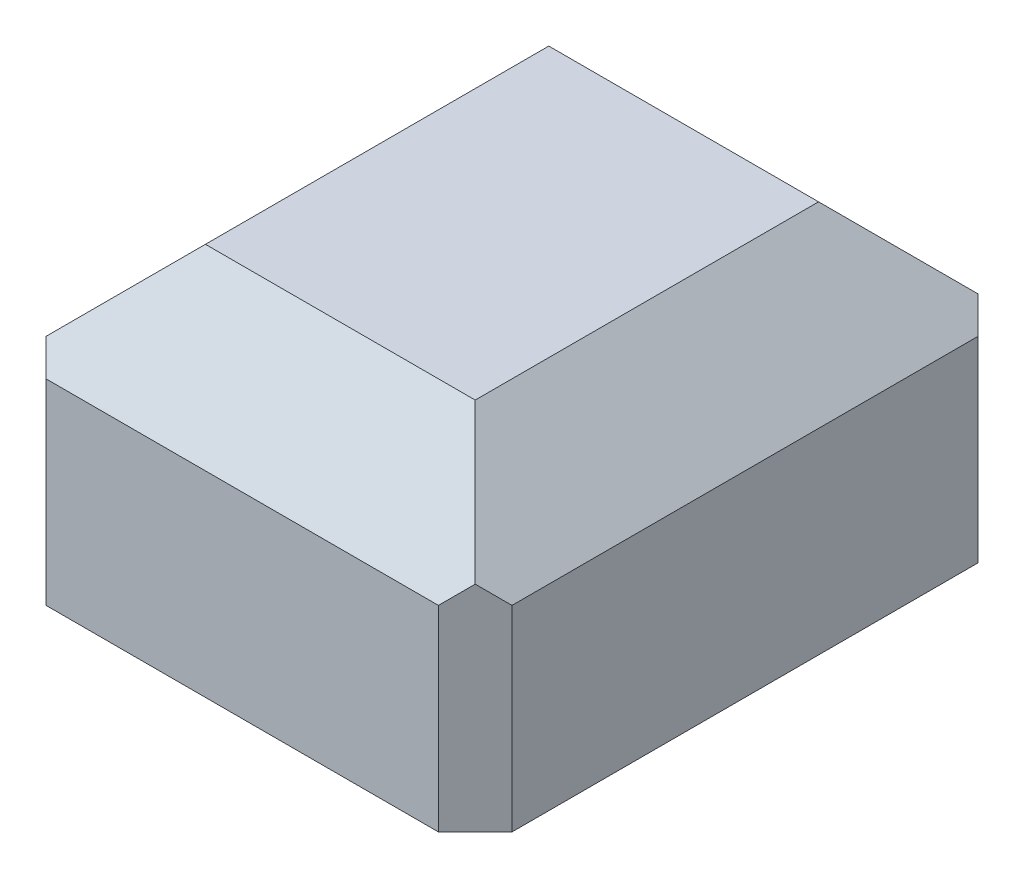
ISO-10303-21;
HEADER;
FILE_DESCRIPTION(('STEP AP214'),'2;1');
FILE_NAME('part.step','',(''),(''),'','','');
FILE_SCHEMA(('AUTOMOTIVE_DESIGN { 1 0 10303 214 1 1 1 1 }'));
ENDSEC;
DATA;
#1=APPLICATION_CONTEXT('core data for automotive mechanical design processes');
#2=APPLICATION_PROTOCOL_DEFINITION('international standard','automotive_design',2000,#1);
#3=PRODUCT_CONTEXT('',#1,'mechanical');
#4=PRODUCT('Part','Part','',(#3));
#5=PRODUCT_RELATED_PRODUCT_CATEGORY('part','',(#4));
#6=PRODUCT_DEFINITION_FORMATION('','',#4);
#7=PRODUCT_DEFINITION_CONTEXT('part definition',#1,'design');
#8=PRODUCT_DEFINITION('design','',#6,#7);
#9=PRODUCT_DEFINITION_SHAPE('','',#8);
#10=(LENGTH_UNIT() NAMED_UNIT(*) SI_UNIT(.MILLI.,.METRE.));
#11=(NAMED_UNIT(*) PLANE_ANGLE_UNIT() SI_UNIT($,.RADIAN.));
#12=(NAMED_UNIT(*) SI_UNIT($,.STERADIAN.) SOLID_ANGLE_UNIT());
#13=UNCERTAINTY_MEASURE_WITH_UNIT(LENGTH_MEASURE(1.E-05),#10,'distance_accuracy_value','');
#14=(GEOMETRIC_REPRESENTATION_CONTEXT(3) GLOBAL_UNCERTAINTY_ASSIGNED_CONTEXT((#13)) GLOBAL_UNIT_ASSIGNED_CONTEXT((#10,
#11,#12)) REPRESENTATION_CONTEXT('',''));
#15=CARTESIAN_POINT('',(0.,0.,0.));
#16=DIRECTION('',(0.,0.,1.));
#17=DIRECTION('',(1.,0.,0.));
#18=AXIS2_PLACEMENT_3D('',#15,#16,#17);
#19=CARTESIAN_POINT('',(0.,0.,0.));
#20=DIRECTION('',(0.,-1.,0.));
#21=DIRECTION('',(0.,0.,-1.));
#22=AXIS2_PLACEMENT_3D('',#19,#20,#21);
#23=PLANE('',#22);
#24=DIRECTION('',(0.,0.,1.));
#25=VECTOR('',#24,1.);
#26=CARTESIAN_POINT('',(-95.,0.,110.));
#27=LINE('',#26,#25);
#28=CARTESIAN_POINT('',(-95.,0.,-94.9999999999999));
#29=VERTEX_POINT('',#28);
#30=CARTESIAN_POINT('',(-95.,0.,94.9999999999999));
#31=VERTEX_POINT('',#30);
#32=EDGE_CURVE('E352',#29,#31,#27,.T.);
#33=ORIENTED_EDGE('',*,*,#32,.F.);
#34=DIRECTION('',(-0.707106781186549,0.,0.707106781186546));
#35=VECTOR('',#34,1.);
#36=CARTESIAN_POINT('',(-94.9999999999998,0.,-95.0000000000002));
#37=LINE('',#36,#35);
#38=CARTESIAN_POINT('',(-79.9999999999999,0.,-110.));
#39=VERTEX_POINT('',#38);
#40=EDGE_CURVE('E416',#29,#39,#37,.F.);
#41=ORIENTED_EDGE('',*,*,#40,.T.);
#42=DIRECTION('',(-1.,0.,0.));
#43=VECTOR('',#42,1.);
#44=CARTESIAN_POINT('',(-95.,0.,-110.));
#45=LINE('',#44,#43);
#46=CARTESIAN_POINT('',(80.,0.,-110.));
#47=VERTEX_POINT('',#46);
#48=EDGE_CURVE('E347',#47,#39,#45,.T.);
#49=ORIENTED_EDGE('',*,*,#48,.F.);
#50=DIRECTION('',(-0.707106781186546,0.,-0.707106781186549));
#51=VECTOR('',#50,1.);
#52=CARTESIAN_POINT('',(95.0000000000002,0.,-94.9999999999998));
#53=LINE('',#52,#51);
#54=CARTESIAN_POINT('',(95.,0.,-94.9999999999999));
#55=VERTEX_POINT('',#54);
#56=EDGE_CURVE('E413',#47,#55,#53,.F.);
#57=ORIENTED_EDGE('',*,*,#56,.T.);
#58=DIRECTION('',(0.,0.,-1.));
#59=VECTOR('',#58,1.);
#60=CARTESIAN_POINT('',(95.,0.,110.));
#61=LINE('',#60,#59);
#62=CARTESIAN_POINT('',(95.,0.,95.));
#63=VERTEX_POINT('',#62);
#64=EDGE_CURVE('E343',#63,#55,#61,.T.);
#65=ORIENTED_EDGE('',*,*,#64,.F.);
#66=DIRECTION('',(0.707106781186549,0.,-0.707106781186546));
#67=VECTOR('',#66,1.);
#68=CARTESIAN_POINT('',(94.9999999999998,0.,95.0000000000002));
#69=LINE('',#68,#67);
#70=CARTESIAN_POINT('',(79.9999999999999,0.,110.));
#71=VERTEX_POINT('',#70);
#72=EDGE_CURVE('E410',#63,#71,#69,.F.);
#73=ORIENTED_EDGE('',*,*,#72,.T.);
#74=DIRECTION('',(1.,0.,0.));
#75=VECTOR('',#74,1.);
#76=CARTESIAN_POINT('',(-95.,0.,110.));
#77=LINE('',#76,#75);
#78=CARTESIAN_POINT('',(-80.,0.,110.));
#79=VERTEX_POINT('',#78);
#80=EDGE_CURVE('E356',#79,#71,#77,.T.);
#81=ORIENTED_EDGE('',*,*,#80,.F.);
#82=DIRECTION('',(0.707106781186546,0.,0.707106781186549));
#83=VECTOR('',#82,1.);
#84=CARTESIAN_POINT('',(-95.0000000000002,0.,94.9999999999998));
#85=LINE('',#84,#83);
#86=EDGE_CURVE('E407',#79,#31,#85,.F.);
#87=ORIENTED_EDGE('',*,*,#86,.T.);
#88=EDGE_LOOP('',(#33,#41,#49,#57,#65,#73,#81,#87));
#89=FACE_BOUND('',#88,.T.);
#90=DIRECTION('',(-0.707106781186549,0.,0.707106781186546));
#91=VECTOR('',#90,1.);
#92=CARTESIAN_POINT('',(-92.8786796564402,0.,-92.8786796564405));
#93=LINE('',#92,#91);
#94=CARTESIAN_POINT('',(-92.,0.,-93.7573593128807));
#95=VERTEX_POINT('',#94);
#96=CARTESIAN_POINT('',(-78.7573593128806,0.,-107.));
#97=VERTEX_POINT('',#96);
#98=EDGE_CURVE('E292',#95,#97,#93,.F.);
#99=ORIENTED_EDGE('',*,*,#98,.F.);
#100=DIRECTION('',(0.,0.,1.));
#101=VECTOR('',#100,1.);
#102=CARTESIAN_POINT('',(-92.,0.,0.));
#103=LINE('',#102,#101);
#104=CARTESIAN_POINT('',(-92.,0.,93.7573593128807));
#105=VERTEX_POINT('',#104);
#106=EDGE_CURVE('E330',#95,#105,#103,.T.);
#107=ORIENTED_EDGE('',*,*,#106,.T.);
#108=DIRECTION('',(0.707106781186546,0.,0.707106781186549));
#109=VECTOR('',#108,1.);
#110=CARTESIAN_POINT('',(-92.8786796564405,0.,92.8786796564402));
#111=LINE('',#110,#109);
#112=CARTESIAN_POINT('',(-78.7573593128807,0.,107.));
#113=VERTEX_POINT('',#112);
#114=EDGE_CURVE('E296',#113,#105,#111,.F.);
#115=ORIENTED_EDGE('',*,*,#114,.F.);
#116=DIRECTION('',(1.,0.,0.));
#117=VECTOR('',#116,1.);
#118=CARTESIAN_POINT('',(0.,0.,107.));
#119=LINE('',#118,#117);
#120=CARTESIAN_POINT('',(78.7573593128806,0.,107.));
#121=VERTEX_POINT('',#120);
#122=EDGE_CURVE('E64',#113,#121,#119,.T.);
#123=ORIENTED_EDGE('',*,*,#122,.T.);
#124=DIRECTION('',(0.707106781186549,0.,-0.707106781186546));
#125=VECTOR('',#124,1.);
#126=CARTESIAN_POINT('',(92.8786796564402,0.,92.8786796564405));
#127=LINE('',#126,#125);
#128=CARTESIAN_POINT('',(92.,0.,93.7573593128807));
#129=VERTEX_POINT('',#128);
#130=EDGE_CURVE('E325',#129,#121,#127,.F.);
#131=ORIENTED_EDGE('',*,*,#130,.F.);
#132=DIRECTION('',(0.,0.,-1.));
#133=VECTOR('',#132,1.);
#134=CARTESIAN_POINT('',(92.,0.,0.));
#135=LINE('',#134,#133);
#136=CARTESIAN_POINT('',(92.,0.,-93.7573593128807));
#137=VERTEX_POINT('',#136);
#138=EDGE_CURVE('E283',#129,#137,#135,.T.);
#139=ORIENTED_EDGE('',*,*,#138,.T.);
#140=DIRECTION('',(-0.707106781186546,0.,-0.707106781186549));
#141=VECTOR('',#140,1.);
#142=CARTESIAN_POINT('',(92.8786796564405,0.,-92.8786796564402));
#143=LINE('',#142,#141);
#144=CARTESIAN_POINT('',(78.7573593128807,0.,-107.));
#145=VERTEX_POINT('',#144);
#146=EDGE_CURVE('E218',#145,#137,#143,.F.);
#147=ORIENTED_EDGE('',*,*,#146,.F.);
#148=DIRECTION('',(-1.,0.,0.));
#149=VECTOR('',#148,1.);
#150=CARTESIAN_POINT('',(0.,0.,-107.));
#151=LINE('',#150,#149);
#152=EDGE_CURVE('E324',#145,#97,#151,.T.);
#153=ORIENTED_EDGE('',*,*,#152,.T.);
#154=EDGE_LOOP('',(#99,#107,#115,#123,#131,#139,#147,#153));
#155=FACE_BOUND('',#154,.T.);
#156=ADVANCED_FACE('F47',(#89,#155),#23,.T.);
#157=CARTESIAN_POINT('',(95.,120.,110.));
#158=DIRECTION('',(-1.,0.,0.));
#159=DIRECTION('',(0.,0.,1.));
#160=AXIS2_PLACEMENT_3D('',#157,#158,#159);
#161=PLANE('',#160);
#162=ORIENTED_EDGE('',*,*,#64,.T.);
#163=DIRECTION('',(0.,1.,0.));
#164=VECTOR('',#163,1.);
#165=CARTESIAN_POINT('',(95.,120.,-94.9999999999999));
#166=LINE('',#165,#164);
#167=CARTESIAN_POINT('',(95.,79.9999999999999,-94.9999999999999));
#168=VERTEX_POINT('',#167);
#169=EDGE_CURVE('E442',#55,#168,#166,.T.);
#170=ORIENTED_EDGE('',*,*,#169,.T.);
#171=DIRECTION('',(0.,0.,1.));
#172=VECTOR('',#171,1.);
#173=CARTESIAN_POINT('',(95.,79.9999999999999,110.));
#174=LINE('',#173,#172);
#175=CARTESIAN_POINT('',(95.,79.9999999999999,95.));
#176=VERTEX_POINT('',#175);
#177=EDGE_CURVE('E385',#168,#176,#174,.T.);
#178=ORIENTED_EDGE('',*,*,#177,.T.);
#179=DIRECTION('',(0.,-1.,0.));
#180=VECTOR('',#179,1.);
#181=CARTESIAN_POINT('',(95.,120.,95.));
#182=LINE('',#181,#180);
#183=EDGE_CURVE('E438',#176,#63,#182,.T.);
#184=ORIENTED_EDGE('',*,*,#183,.T.);
#185=EDGE_LOOP('',(#162,#170,#178,#184));
#186=FACE_BOUND('',#185,.T.);
#187=ADVANCED_FACE('F476',(#186),#161,.F.);
#188=CARTESIAN_POINT('',(-95.,120.,-110.));
#189=DIRECTION('',(0.,0.,1.));
#190=DIRECTION('',(1.,0.,0.));
#191=AXIS2_PLACEMENT_3D('',#188,#189,#190);
#192=PLANE('',#191);
#193=ORIENTED_EDGE('',*,*,#48,.T.);
#194=DIRECTION('',(0.,1.,0.));
#195=VECTOR('',#194,1.);
#196=CARTESIAN_POINT('',(-79.9999999999999,120.,-110.));
#197=LINE('',#196,#195);
#198=CARTESIAN_POINT('',(-79.9999999999999,79.9999999999999,-110.));
#199=VERTEX_POINT('',#198);
#200=EDGE_CURVE('E423',#39,#199,#197,.T.);
#201=ORIENTED_EDGE('',*,*,#200,.T.);
#202=DIRECTION('',(1.,0.,0.));
#203=VECTOR('',#202,1.);
#204=CARTESIAN_POINT('',(-95.,79.9999999999999,-110.));
#205=LINE('',#204,#203);
#206=CARTESIAN_POINT('',(80.,79.9999999999999,-110.));
#207=VERTEX_POINT('',#206);
#208=EDGE_CURVE('E381',#199,#207,#205,.T.);
#209=ORIENTED_EDGE('',*,*,#208,.T.);
#210=DIRECTION('',(0.,-1.,0.));
#211=VECTOR('',#210,1.);
#212=CARTESIAN_POINT('',(80.,120.,-110.));
#213=LINE('',#212,#211);
#214=EDGE_CURVE('E419',#207,#47,#213,.T.);
#215=ORIENTED_EDGE('',*,*,#214,.T.);
#216=EDGE_LOOP('',(#193,#201,#209,#215));
#217=FACE_BOUND('',#216,.T.);
#218=ADVANCED_FACE('F504',(#217),#192,.F.);
#219=CARTESIAN_POINT('',(-95.,120.,110.));
#220=DIRECTION('',(1.,0.,0.));
#221=DIRECTION('',(0.,0.,-1.));
#222=AXIS2_PLACEMENT_3D('',#219,#220,#221);
#223=PLANE('',#222);
#224=DIRECTION('',(0.,0.,-1.));
#225=VECTOR('',#224,1.);
#226=CARTESIAN_POINT('',(-95.,79.9999999999999,110.));
#227=LINE('',#226,#225);
#228=CARTESIAN_POINT('',(-95.,79.9999999999999,94.9999999999999));
#229=VERTEX_POINT('',#228);
#230=CARTESIAN_POINT('',(-95.,79.9999999999999,-94.9999999999999));
#231=VERTEX_POINT('',#230);
#232=EDGE_CURVE('E377',#229,#231,#227,.T.);
#233=ORIENTED_EDGE('',*,*,#232,.T.);
#234=DIRECTION('',(0.,-1.,0.));
#235=VECTOR('',#234,1.);
#236=CARTESIAN_POINT('',(-95.,120.,-94.9999999999999));
#237=LINE('',#236,#235);
#238=EDGE_CURVE('E403',#231,#29,#237,.T.);
#239=ORIENTED_EDGE('',*,*,#238,.T.);
#240=ORIENTED_EDGE('',*,*,#32,.T.);
#241=DIRECTION('',(0.,1.,0.));
#242=VECTOR('',#241,1.);
#243=CARTESIAN_POINT('',(-95.,120.,94.9999999999999));
#244=LINE('',#243,#242);
#245=EDGE_CURVE('E389',#31,#229,#244,.T.);
#246=ORIENTED_EDGE('',*,*,#245,.T.);
#247=EDGE_LOOP('',(#233,#239,#240,#246));
#248=FACE_BOUND('',#247,.T.);
#249=ADVANCED_FACE('F513',(#248),#223,.F.);
#250=CARTESIAN_POINT('',(-95.,120.,110.));
#251=DIRECTION('',(0.,0.,-1.));
#252=DIRECTION('',(-1.,0.,0.));
#253=AXIS2_PLACEMENT_3D('',#250,#251,#252);
#254=PLANE('',#253);
#255=ORIENTED_EDGE('',*,*,#80,.T.);
#256=DIRECTION('',(0.,1.,0.));
#257=VECTOR('',#256,1.);
#258=CARTESIAN_POINT('',(79.9999999999999,120.,110.));
#259=LINE('',#258,#257);
#260=CARTESIAN_POINT('',(79.9999999999999,79.9999999999999,110.));
#261=VERTEX_POINT('',#260);
#262=EDGE_CURVE('E455',#71,#261,#259,.T.);
#263=ORIENTED_EDGE('',*,*,#262,.T.);
#264=DIRECTION('',(-1.,0.,0.));
#265=VECTOR('',#264,1.);
#266=CARTESIAN_POINT('',(-95.,79.9999999999999,110.));
#267=LINE('',#266,#265);
#268=CARTESIAN_POINT('',(-80.,79.9999999999999,110.));
#269=VERTEX_POINT('',#268);
#270=EDGE_CURVE('E374',#261,#269,#267,.T.);
#271=ORIENTED_EDGE('',*,*,#270,.T.);
#272=DIRECTION('',(0.,-1.,0.));
#273=VECTOR('',#272,1.);
#274=CARTESIAN_POINT('',(-80.,120.,110.));
#275=LINE('',#274,#273);
#276=EDGE_CURVE('E451',#269,#79,#275,.T.);
#277=ORIENTED_EDGE('',*,*,#276,.T.);
#278=EDGE_LOOP('',(#255,#263,#271,#277));
#279=FACE_BOUND('',#278,.T.);
#280=ADVANCED_FACE('F460',(#279),#254,.F.);
#281=CARTESIAN_POINT('',(0.,120.,0.));
#282=DIRECTION('',(0.,-1.,0.));
#283=DIRECTION('',(0.,0.,-1.));
#284=AXIS2_PLACEMENT_3D('',#281,#282,#283);
#285=PLANE('',#284);
#286=DIRECTION('',(0.,0.,1.));
#287=VECTOR('',#286,1.);
#288=CARTESIAN_POINT('',(-55.,120.,0.));
#289=LINE('',#288,#287);
#290=CARTESIAN_POINT('',(-55.,120.,-70.));
#291=VERTEX_POINT('',#290);
#292=CARTESIAN_POINT('',(-55.,120.,70.));
#293=VERTEX_POINT('',#292);
#294=EDGE_CURVE('E367',#291,#293,#289,.T.);
#295=ORIENTED_EDGE('',*,*,#294,.T.);
#296=DIRECTION('',(1.,0.,0.));
#297=VECTOR('',#296,1.);
#298=CARTESIAN_POINT('',(0.,120.,70.));
#299=LINE('',#298,#297);
#300=CARTESIAN_POINT('',(55.,120.,70.));
#301=VERTEX_POINT('',#300);
#302=EDGE_CURVE('E370',#293,#301,#299,.T.);
#303=ORIENTED_EDGE('',*,*,#302,.T.);
#304=DIRECTION('',(0.,0.,-1.));
#305=VECTOR('',#304,1.);
#306=CARTESIAN_POINT('',(55.,120.,0.));
#307=LINE('',#306,#305);
#308=CARTESIAN_POINT('',(55.,120.,-70.));
#309=VERTEX_POINT('',#308);
#310=EDGE_CURVE('E360',#301,#309,#307,.T.);
#311=ORIENTED_EDGE('',*,*,#310,.T.);
#312=DIRECTION('',(-1.,0.,0.));
#313=VECTOR('',#312,1.);
#314=CARTESIAN_POINT('',(0.,120.,-70.));
#315=LINE('',#314,#313);
#316=EDGE_CURVE('E364',#309,#291,#315,.T.);
#317=ORIENTED_EDGE('',*,*,#316,.T.);
#318=EDGE_LOOP('',(#295,#303,#311,#317));
#319=FACE_BOUND('',#318,.T.);
#320=ADVANCED_FACE('F491',(#319),#285,.F.);
#321=CARTESIAN_POINT('',(0.,120.,-70.));
#322=DIRECTION('',(0.,-0.707106781186546,0.707106781186549));
#323=DIRECTION('',(-1.,0.,0.));
#324=AXIS2_PLACEMENT_3D('',#321,#322,#323);
#325=PLANE('',#324);
#326=ORIENTED_EDGE('',*,*,#208,.F.);
#327=DIRECTION('',(-0.577350269189627,0.577350269189626,0.577350269189624));
#328=VECTOR('',#327,1.);
#329=CARTESIAN_POINT('',(-79.9999999999999,79.9999999999999,-110.));
#330=LINE('',#329,#328);
#331=CARTESIAN_POINT('',(-87.5,87.4999999999999,-102.5));
#332=VERTEX_POINT('',#331);
#333=EDGE_CURVE('E429',#199,#332,#330,.T.);
#334=ORIENTED_EDGE('',*,*,#333,.T.);
#335=DIRECTION('',(0.577350269189625,0.577350269189627,0.577350269189625));
#336=VECTOR('',#335,1.);
#337=CARTESIAN_POINT('',(-36.6666666666667,138.333333333333,-51.6666666666667));
#338=LINE('',#337,#336);
#339=EDGE_CURVE('E348',#291,#332,#338,.F.);
#340=ORIENTED_EDGE('',*,*,#339,.F.);
#341=ORIENTED_EDGE('',*,*,#316,.F.);
#342=DIRECTION('',(-0.577350269189625,0.577350269189627,0.577350269189625));
#343=VECTOR('',#342,1.);
#344=CARTESIAN_POINT('',(31.6666666666667,143.333333333333,-46.6666666666667));
#345=LINE('',#344,#343);
#346=CARTESIAN_POINT('',(87.5,87.4999999999999,-102.5));
#347=VERTEX_POINT('',#346);
#348=EDGE_CURVE('E395',#347,#309,#345,.T.);
#349=ORIENTED_EDGE('',*,*,#348,.F.);
#350=DIRECTION('',(-0.577350269189624,-0.577350269189628,-0.577350269189626));
#351=VECTOR('',#350,1.);
#352=CARTESIAN_POINT('',(80.0000000000002,80.0000000000001,-110.));
#353=LINE('',#352,#351);
#354=EDGE_CURVE('E426',#347,#207,#353,.T.);
#355=ORIENTED_EDGE('',*,*,#354,.T.);
#356=EDGE_LOOP('',(#326,#334,#340,#341,#349,#355));
#357=FACE_BOUND('',#356,.T.);
#358=ADVANCED_FACE('F487',(#357),#325,.F.);
#359=CARTESIAN_POINT('',(-55.,120.,0.));
#360=DIRECTION('',(0.707106781186549,-0.707106781186546,0.));
#361=DIRECTION('',(0.,0.,1.));
#362=AXIS2_PLACEMENT_3D('',#359,#360,#361);
#363=PLANE('',#362);
#364=ORIENTED_EDGE('',*,*,#339,.T.);
#365=DIRECTION('',(-0.577350269189626,-0.577350269189628,0.577350269189624));
#366=VECTOR('',#365,1.);
#367=CARTESIAN_POINT('',(-99.9999999999998,75.0000000000001,-90.0000000000002));
#368=LINE('',#367,#366);
#369=EDGE_CURVE('E435',#332,#231,#368,.T.);
#370=ORIENTED_EDGE('',*,*,#369,.T.);
#371=ORIENTED_EDGE('',*,*,#232,.F.);
#372=DIRECTION('',(0.577350269189624,0.577350269189626,0.577350269189627));
#373=VECTOR('',#372,1.);
#374=CARTESIAN_POINT('',(-100.,74.9999999999999,89.9999999999999));
#375=LINE('',#374,#373);
#376=CARTESIAN_POINT('',(-87.5,87.5,102.5));
#377=VERTEX_POINT('',#376);
#378=EDGE_CURVE('E432',#229,#377,#375,.T.);
#379=ORIENTED_EDGE('',*,*,#378,.T.);
#380=DIRECTION('',(0.577350269189625,0.577350269189627,-0.577350269189625));
#381=VECTOR('',#380,1.);
#382=CARTESIAN_POINT('',(-31.6666666666667,143.333333333333,46.6666666666667));
#383=LINE('',#382,#381);
#384=EDGE_CURVE('E392',#293,#377,#383,.F.);
#385=ORIENTED_EDGE('',*,*,#384,.F.);
#386=ORIENTED_EDGE('',*,*,#294,.F.);
#387=EDGE_LOOP('',(#364,#370,#371,#379,#385,#386));
#388=FACE_BOUND('',#387,.T.);
#389=ADVANCED_FACE('F510',(#388),#363,.F.);
#390=CARTESIAN_POINT('',(55.,120.,0.));
#391=DIRECTION('',(-0.707106781186549,-0.707106781186546,0.));
#392=DIRECTION('',(0.,0.,-1.));
#393=AXIS2_PLACEMENT_3D('',#390,#391,#392);
#394=PLANE('',#393);
#395=ORIENTED_EDGE('',*,*,#177,.F.);
#396=DIRECTION('',(-0.577350269189624,0.577350269189626,-0.577350269189627));
#397=VECTOR('',#396,1.);
#398=CARTESIAN_POINT('',(100.,74.9999999999999,-89.9999999999999));
#399=LINE('',#398,#397);
#400=EDGE_CURVE('E448',#168,#347,#399,.T.);
#401=ORIENTED_EDGE('',*,*,#400,.T.);
#402=ORIENTED_EDGE('',*,*,#348,.T.);
#403=ORIENTED_EDGE('',*,*,#310,.F.);
#404=DIRECTION('',(0.577350269189625,-0.577350269189627,0.577350269189625));
#405=VECTOR('',#404,1.);
#406=CARTESIAN_POINT('',(31.6666666666667,143.333333333333,46.6666666666667));
#407=LINE('',#406,#405);
#408=CARTESIAN_POINT('',(87.4999999999999,87.5,102.5));
#409=VERTEX_POINT('',#408);
#410=EDGE_CURVE('E316',#409,#301,#407,.F.);
#411=ORIENTED_EDGE('',*,*,#410,.F.);
#412=DIRECTION('',(0.577350269189626,-0.577350269189628,-0.577350269189624));
#413=VECTOR('',#412,1.);
#414=CARTESIAN_POINT('',(99.9999999999998,75.0000000000001,90.0000000000002));
#415=LINE('',#414,#413);
#416=EDGE_CURVE('E445',#409,#176,#415,.T.);
#417=ORIENTED_EDGE('',*,*,#416,.T.);
#418=EDGE_LOOP('',(#395,#401,#402,#403,#411,#417));
#419=FACE_BOUND('',#418,.T.);
#420=ADVANCED_FACE('F472',(#419),#394,.F.);
#421=CARTESIAN_POINT('',(0.,120.,70.));
#422=DIRECTION('',(0.,-0.707106781186546,-0.707106781186549));
#423=DIRECTION('',(1.,0.,0.));
#424=AXIS2_PLACEMENT_3D('',#421,#422,#423);
#425=PLANE('',#424);
#426=ORIENTED_EDGE('',*,*,#270,.F.);
#427=DIRECTION('',(0.577350269189627,0.577350269189626,-0.577350269189624));
#428=VECTOR('',#427,1.);
#429=CARTESIAN_POINT('',(79.9999999999999,79.9999999999999,110.));
#430=LINE('',#429,#428);
#431=EDGE_CURVE('E11',#261,#409,#430,.T.);
#432=ORIENTED_EDGE('',*,*,#431,.T.);
#433=ORIENTED_EDGE('',*,*,#410,.T.);
#434=ORIENTED_EDGE('',*,*,#302,.F.);
#435=ORIENTED_EDGE('',*,*,#384,.T.);
#436=DIRECTION('',(0.577350269189624,-0.577350269189628,0.577350269189626));
#437=VECTOR('',#436,1.);
#438=CARTESIAN_POINT('',(-80.0000000000002,80.0000000000001,110.));
#439=LINE('',#438,#437);
#440=EDGE_CURVE('E57',#377,#269,#439,.T.);
#441=ORIENTED_EDGE('',*,*,#440,.T.);
#442=EDGE_LOOP('',(#426,#432,#433,#434,#435,#441));
#443=FACE_BOUND('',#442,.T.);
#444=ADVANCED_FACE('F465',(#443),#425,.F.);
#445=CARTESIAN_POINT('',(-95.,120.,-94.9999999999999));
#446=DIRECTION('',(0.707106781186546,0.,0.707106781186549));
#447=DIRECTION('',(0.,-1.,0.));
#448=AXIS2_PLACEMENT_3D('',#445,#446,#447);
#449=PLANE('',#448);
#450=ORIENTED_EDGE('',*,*,#333,.F.);
#451=ORIENTED_EDGE('',*,*,#200,.F.);
#452=ORIENTED_EDGE('',*,*,#40,.F.);
#453=ORIENTED_EDGE('',*,*,#238,.F.);
#454=ORIENTED_EDGE('',*,*,#369,.F.);
#455=EDGE_LOOP('',(#450,#451,#452,#453,#454));
#456=FACE_BOUND('',#455,.T.);
#457=ADVANCED_FACE('F507',(#456),#449,.F.);
#458=CARTESIAN_POINT('',(80.,120.,-110.));
#459=DIRECTION('',(-0.707106781186549,0.,0.707106781186546));
#460=DIRECTION('',(0.,-1.,0.));
#461=AXIS2_PLACEMENT_3D('',#458,#459,#460);
#462=PLANE('',#461);
#463=ORIENTED_EDGE('',*,*,#400,.F.);
#464=ORIENTED_EDGE('',*,*,#169,.F.);
#465=ORIENTED_EDGE('',*,*,#56,.F.);
#466=ORIENTED_EDGE('',*,*,#214,.F.);
#467=ORIENTED_EDGE('',*,*,#354,.F.);
#468=EDGE_LOOP('',(#463,#464,#465,#466,#467));
#469=FACE_BOUND('',#468,.T.);
#470=ADVANCED_FACE('F480',(#469),#462,.F.);
#471=CARTESIAN_POINT('',(95.,120.,95.));
#472=DIRECTION('',(-0.707106781186546,0.,-0.707106781186549));
#473=DIRECTION('',(0.,-1.,0.));
#474=AXIS2_PLACEMENT_3D('',#471,#472,#473);
#475=PLANE('',#474);
#476=ORIENTED_EDGE('',*,*,#431,.F.);
#477=ORIENTED_EDGE('',*,*,#262,.F.);
#478=ORIENTED_EDGE('',*,*,#72,.F.);
#479=ORIENTED_EDGE('',*,*,#183,.F.);
#480=ORIENTED_EDGE('',*,*,#416,.F.);
#481=EDGE_LOOP('',(#476,#477,#478,#479,#480));
#482=FACE_BOUND('',#481,.T.);
#483=ADVANCED_FACE('F468',(#482),#475,.F.);
#484=CARTESIAN_POINT('',(-80.,120.,110.));
#485=DIRECTION('',(0.707106781186549,0.,-0.707106781186546));
#486=DIRECTION('',(0.,-1.,0.));
#487=AXIS2_PLACEMENT_3D('',#484,#485,#486);
#488=PLANE('',#487);
#489=ORIENTED_EDGE('',*,*,#378,.F.);
#490=ORIENTED_EDGE('',*,*,#245,.F.);
#491=ORIENTED_EDGE('',*,*,#86,.F.);
#492=ORIENTED_EDGE('',*,*,#276,.F.);
#493=ORIENTED_EDGE('',*,*,#440,.F.);
#494=EDGE_LOOP('',(#489,#490,#491,#492,#493));
#495=FACE_BOUND('',#494,.T.);
#496=ADVANCED_FACE('F50',(#495),#488,.F.);
#497=CARTESIAN_POINT('',(92.,120.,110.));
#498=DIRECTION('',(-1.,0.,0.));
#499=DIRECTION('',(0.,0.,1.));
#500=AXIS2_PLACEMENT_3D('',#497,#498,#499);
#501=PLANE('',#500);
#502=ORIENTED_EDGE('',*,*,#138,.F.);
#503=DIRECTION('',(0.,1.,0.));
#504=VECTOR('',#503,1.);
#505=CARTESIAN_POINT('',(92.,120.,93.7573593128807));
#506=LINE('',#505,#504);
#507=CARTESIAN_POINT('',(92.,78.7573593128806,93.7573593128807));
#508=VERTEX_POINT('',#507);
#509=EDGE_CURVE('E224',#508,#129,#506,.F.);
#510=ORIENTED_EDGE('',*,*,#509,.F.);
#511=DIRECTION('',(0.,0.,-1.));
#512=VECTOR('',#511,1.);
#513=CARTESIAN_POINT('',(92.,78.7573593128806,0.));
#514=LINE('',#513,#512);
#515=CARTESIAN_POINT('',(92.,78.7573593128806,-93.7573593128807));
#516=VERTEX_POINT('',#515);
#517=EDGE_CURVE('E228',#516,#508,#514,.F.);
#518=ORIENTED_EDGE('',*,*,#517,.F.);
#519=DIRECTION('',(0.,-1.,0.));
#520=VECTOR('',#519,1.);
#521=CARTESIAN_POINT('',(92.,120.,-93.7573593128807));
#522=LINE('',#521,#520);
#523=EDGE_CURVE('E211',#137,#516,#522,.F.);
#524=ORIENTED_EDGE('',*,*,#523,.F.);
#525=EDGE_LOOP('',(#502,#510,#518,#524));
#526=FACE_BOUND('',#525,.T.);
#527=ADVANCED_FACE('F229',(#526),#501,.T.);
#528=CARTESIAN_POINT('',(-95.,120.,-107.));
#529=DIRECTION('',(0.,0.,1.));
#530=DIRECTION('',(1.,0.,0.));
#531=AXIS2_PLACEMENT_3D('',#528,#529,#530);
#532=PLANE('',#531);
#533=ORIENTED_EDGE('',*,*,#152,.F.);
#534=DIRECTION('',(0.,1.,0.));
#535=VECTOR('',#534,1.);
#536=CARTESIAN_POINT('',(78.7573593128807,120.,-107.));
#537=LINE('',#536,#535);
#538=CARTESIAN_POINT('',(78.7573593128807,78.7573593128806,-107.));
#539=VERTEX_POINT('',#538);
#540=EDGE_CURVE('E289',#539,#145,#537,.F.);
#541=ORIENTED_EDGE('',*,*,#540,.F.);
#542=DIRECTION('',(-1.,0.,0.));
#543=VECTOR('',#542,1.);
#544=CARTESIAN_POINT('',(0.,78.7573593128806,-107.));
#545=LINE('',#544,#543);
#546=CARTESIAN_POINT('',(-78.7573593128806,78.7573593128806,-107.));
#547=VERTEX_POINT('',#546);
#548=EDGE_CURVE('E234',#547,#539,#545,.F.);
#549=ORIENTED_EDGE('',*,*,#548,.F.);
#550=DIRECTION('',(0.,-1.,0.));
#551=VECTOR('',#550,1.);
#552=CARTESIAN_POINT('',(-78.7573593128806,120.,-107.));
#553=LINE('',#552,#551);
#554=EDGE_CURVE('E286',#97,#547,#553,.F.);
#555=ORIENTED_EDGE('',*,*,#554,.F.);
#556=EDGE_LOOP('',(#533,#541,#549,#555));
#557=FACE_BOUND('',#556,.T.);
#558=ADVANCED_FACE('F571',(#557),#532,.T.);
#559=CARTESIAN_POINT('',(-92.,120.,110.));
#560=DIRECTION('',(1.,0.,0.));
#561=DIRECTION('',(0.,0.,-1.));
#562=AXIS2_PLACEMENT_3D('',#559,#560,#561);
#563=PLANE('',#562);
#564=DIRECTION('',(0.,0.,1.));
#565=VECTOR('',#564,1.);
#566=CARTESIAN_POINT('',(-92.,78.7573593128806,0.));
#567=LINE('',#566,#565);
#568=CARTESIAN_POINT('',(-92.,78.7573593128806,93.7573593128807));
#569=VERTEX_POINT('',#568);
#570=CARTESIAN_POINT('',(-92.,78.7573593128806,-93.7573593128807));
#571=VERTEX_POINT('',#570);
#572=EDGE_CURVE('E274',#569,#571,#567,.F.);
#573=ORIENTED_EDGE('',*,*,#572,.F.);
#574=DIRECTION('',(0.,-1.,0.));
#575=VECTOR('',#574,1.);
#576=CARTESIAN_POINT('',(-92.,120.,93.7573593128807));
#577=LINE('',#576,#575);
#578=EDGE_CURVE('E233',#105,#569,#577,.F.);
#579=ORIENTED_EDGE('',*,*,#578,.F.);
#580=ORIENTED_EDGE('',*,*,#106,.F.);
#581=DIRECTION('',(0.,1.,0.));
#582=VECTOR('',#581,1.);
#583=CARTESIAN_POINT('',(-92.,120.,-93.7573593128807));
#584=LINE('',#583,#582);
#585=EDGE_CURVE('E293',#571,#95,#584,.F.);
#586=ORIENTED_EDGE('',*,*,#585,.F.);
#587=EDGE_LOOP('',(#573,#579,#580,#586));
#588=FACE_BOUND('',#587,.T.);
#589=ADVANCED_FACE('F568',(#588),#563,.T.);
#590=CARTESIAN_POINT('',(-95.,120.,107.));
#591=DIRECTION('',(0.,0.,-1.));
#592=DIRECTION('',(-1.,0.,0.));
#593=AXIS2_PLACEMENT_3D('',#590,#591,#592);
#594=PLANE('',#593);
#595=ORIENTED_EDGE('',*,*,#122,.F.);
#596=DIRECTION('',(0.,1.,0.));
#597=VECTOR('',#596,1.);
#598=CARTESIAN_POINT('',(-78.7573593128807,120.,107.));
#599=LINE('',#598,#597);
#600=CARTESIAN_POINT('',(-78.7573593128807,78.7573593128806,107.));
#601=VERTEX_POINT('',#600);
#602=EDGE_CURVE('E241',#601,#113,#599,.F.);
#603=ORIENTED_EDGE('',*,*,#602,.F.);
#604=DIRECTION('',(1.,0.,0.));
#605=VECTOR('',#604,1.);
#606=CARTESIAN_POINT('',(0.,78.7573593128806,107.));
#607=LINE('',#606,#605);
#608=CARTESIAN_POINT('',(78.7573593128806,78.7573593128806,107.));
#609=VERTEX_POINT('',#608);
#610=EDGE_CURVE('E268',#609,#601,#607,.F.);
#611=ORIENTED_EDGE('',*,*,#610,.F.);
#612=DIRECTION('',(0.,-1.,0.));
#613=VECTOR('',#612,1.);
#614=CARTESIAN_POINT('',(78.7573593128806,120.,107.));
#615=LINE('',#614,#613);
#616=EDGE_CURVE('E245',#121,#609,#615,.F.);
#617=ORIENTED_EDGE('',*,*,#616,.F.);
#618=EDGE_LOOP('',(#595,#603,#611,#617));
#619=FACE_BOUND('',#618,.T.);
#620=ADVANCED_FACE('F564',(#619),#594,.T.);
#621=CARTESIAN_POINT('',(0.,117.,0.));
#622=DIRECTION('',(0.,-1.,0.));
#623=DIRECTION('',(0.,0.,-1.));
#624=AXIS2_PLACEMENT_3D('',#621,#622,#623);
#625=PLANE('',#624);
#626=DIRECTION('',(0.,0.,-1.));
#627=VECTOR('',#626,1.);
#628=CARTESIAN_POINT('',(-53.7573593128808,117.,0.));
#629=LINE('',#628,#627);
#630=CARTESIAN_POINT('',(-53.7573593128808,117.,-68.7573593128807));
#631=VERTEX_POINT('',#630);
#632=CARTESIAN_POINT('',(-53.7573593128808,117.,68.7573593128808));
#633=VERTEX_POINT('',#632);
#634=EDGE_CURVE('E261',#631,#633,#629,.F.);
#635=ORIENTED_EDGE('',*,*,#634,.F.);
#636=DIRECTION('',(1.,0.,0.));
#637=VECTOR('',#636,1.);
#638=CARTESIAN_POINT('',(0.,117.,-68.7573593128807));
#639=LINE('',#638,#637);
#640=CARTESIAN_POINT('',(53.7573593128807,117.,-68.7573593128807));
#641=VERTEX_POINT('',#640);
#642=EDGE_CURVE('E257',#641,#631,#639,.F.);
#643=ORIENTED_EDGE('',*,*,#642,.F.);
#644=DIRECTION('',(0.,0.,1.));
#645=VECTOR('',#644,1.);
#646=CARTESIAN_POINT('',(53.7573593128807,117.,0.));
#647=LINE('',#646,#645);
#648=CARTESIAN_POINT('',(53.7573593128807,117.,68.7573593128808));
#649=VERTEX_POINT('',#648);
#650=EDGE_CURVE('E254',#649,#641,#647,.F.);
#651=ORIENTED_EDGE('',*,*,#650,.F.);
#652=DIRECTION('',(-1.,0.,0.));
#653=VECTOR('',#652,1.);
#654=CARTESIAN_POINT('',(0.,117.,68.7573593128808));
#655=LINE('',#654,#653);
#656=EDGE_CURVE('E264',#633,#649,#655,.F.);
#657=ORIENTED_EDGE('',*,*,#656,.F.);
#658=EDGE_LOOP('',(#635,#643,#651,#657));
#659=FACE_BOUND('',#658,.T.);
#660=ADVANCED_FACE('F560',(#659),#625,.T.);
#661=CARTESIAN_POINT('',(0.,117.87867965644,-67.8786796564404));
#662=DIRECTION('',(0.,-0.707106781186546,0.707106781186549));
#663=DIRECTION('',(-1.,0.,0.));
#664=AXIS2_PLACEMENT_3D('',#661,#662,#663);
#665=PLANE('',#664);
#666=ORIENTED_EDGE('',*,*,#548,.T.);
#667=DIRECTION('',(-0.577350269189624,-0.577350269189628,-0.577350269189626));
#668=VECTOR('',#667,1.);
#669=CARTESIAN_POINT('',(78.5857864376271,78.585786437627,-107.171572875254));
#670=LINE('',#669,#668);
#671=CARTESIAN_POINT('',(85.3786796564403,85.3786796564403,-100.37867965644));
#672=VERTEX_POINT('',#671);
#673=EDGE_CURVE('E279',#672,#539,#670,.T.);
#674=ORIENTED_EDGE('',*,*,#673,.F.);
#675=DIRECTION('',(-0.577350269189625,0.577350269189627,0.577350269189625));
#676=VECTOR('',#675,1.);
#677=CARTESIAN_POINT('',(30.2524531042936,140.504906208587,-45.2524531042936));
#678=LINE('',#677,#676);
#679=EDGE_CURVE('E238',#672,#641,#678,.T.);
#680=ORIENTED_EDGE('',*,*,#679,.T.);
#681=ORIENTED_EDGE('',*,*,#642,.T.);
#682=DIRECTION('',(-0.577350269189625,-0.577350269189627,-0.577350269189625));
#683=VECTOR('',#682,1.);
#684=CARTESIAN_POINT('',(-30.2524531042937,140.504906208587,-45.2524531042936));
#685=LINE('',#684,#683);
#686=CARTESIAN_POINT('',(-85.3786796564403,85.3786796564403,-100.37867965644));
#687=VERTEX_POINT('',#686);
#688=EDGE_CURVE('E252',#631,#687,#685,.T.);
#689=ORIENTED_EDGE('',*,*,#688,.T.);
#690=DIRECTION('',(-0.577350269189627,0.577350269189626,0.577350269189624));
#691=VECTOR('',#690,1.);
#692=CARTESIAN_POINT('',(-78.5857864376268,78.5857864376268,-107.171572875254));
#693=LINE('',#692,#691);
#694=EDGE_CURVE('E275',#547,#687,#693,.T.);
#695=ORIENTED_EDGE('',*,*,#694,.F.);
#696=EDGE_LOOP('',(#666,#674,#680,#681,#689,#695));
#697=FACE_BOUND('',#696,.T.);
#698=ADVANCED_FACE('F556',(#697),#665,.T.);
#699=CARTESIAN_POINT('',(-52.8786796564404,117.87867965644,0.));
#700=DIRECTION('',(0.707106781186549,-0.707106781186546,0.));
#701=DIRECTION('',(0.,0.,1.));
#702=AXIS2_PLACEMENT_3D('',#699,#700,#701);
#703=PLANE('',#702);
#704=ORIENTED_EDGE('',*,*,#688,.F.);
#705=ORIENTED_EDGE('',*,*,#634,.T.);
#706=DIRECTION('',(-0.577350269189625,-0.577350269189627,0.577350269189625));
#707=VECTOR('',#706,1.);
#708=CARTESIAN_POINT('',(-35.2524531042936,135.504906208587,50.2524531042936));
#709=LINE('',#708,#707);
#710=CARTESIAN_POINT('',(-85.3786796564403,85.3786796564403,100.37867965644));
#711=VERTEX_POINT('',#710);
#712=EDGE_CURVE('E253',#633,#711,#709,.T.);
#713=ORIENTED_EDGE('',*,*,#712,.T.);
#714=DIRECTION('',(0.577350269189624,0.577350269189626,0.577350269189627));
#715=VECTOR('',#714,1.);
#716=CARTESIAN_POINT('',(-97.1715728752538,73.5857864376268,88.5857864376268));
#717=LINE('',#716,#715);
#718=EDGE_CURVE('E278',#569,#711,#717,.T.);
#719=ORIENTED_EDGE('',*,*,#718,.F.);
#720=ORIENTED_EDGE('',*,*,#572,.T.);
#721=DIRECTION('',(-0.577350269189626,-0.577350269189628,0.577350269189624));
#722=VECTOR('',#721,1.);
#723=CARTESIAN_POINT('',(-97.1715728752536,73.585786437627,-88.5857864376271));
#724=LINE('',#723,#722);
#725=EDGE_CURVE('E297',#687,#571,#724,.T.);
#726=ORIENTED_EDGE('',*,*,#725,.F.);
#727=EDGE_LOOP('',(#704,#705,#713,#719,#720,#726));
#728=FACE_BOUND('',#727,.T.);
#729=ADVANCED_FACE('F553',(#728),#703,.T.);
#730=CARTESIAN_POINT('',(52.8786796564404,117.87867965644,0.));
#731=DIRECTION('',(-0.707106781186549,-0.707106781186546,0.));
#732=DIRECTION('',(0.,0.,-1.));
#733=AXIS2_PLACEMENT_3D('',#730,#731,#732);
#734=PLANE('',#733);
#735=ORIENTED_EDGE('',*,*,#517,.T.);
#736=DIRECTION('',(0.577350269189626,-0.577350269189628,-0.577350269189624));
#737=VECTOR('',#736,1.);
#738=CARTESIAN_POINT('',(97.1715728752536,73.585786437627,88.5857864376271));
#739=LINE('',#738,#737);
#740=CARTESIAN_POINT('',(85.3786796564403,85.3786796564403,100.37867965644));
#741=VERTEX_POINT('',#740);
#742=EDGE_CURVE('E223',#741,#508,#739,.T.);
#743=ORIENTED_EDGE('',*,*,#742,.F.);
#744=DIRECTION('',(-0.577350269189625,0.577350269189627,-0.577350269189625));
#745=VECTOR('',#744,1.);
#746=CARTESIAN_POINT('',(35.2524531042936,135.504906208587,50.2524531042936));
#747=LINE('',#746,#745);
#748=EDGE_CURVE('E258',#741,#649,#747,.T.);
#749=ORIENTED_EDGE('',*,*,#748,.T.);
#750=ORIENTED_EDGE('',*,*,#650,.T.);
#751=ORIENTED_EDGE('',*,*,#679,.F.);
#752=DIRECTION('',(-0.577350269189624,0.577350269189626,-0.577350269189627));
#753=VECTOR('',#752,1.);
#754=CARTESIAN_POINT('',(97.1715728752538,73.5857864376268,-88.5857864376268));
#755=LINE('',#754,#753);
#756=EDGE_CURVE('E215',#516,#672,#755,.T.);
#757=ORIENTED_EDGE('',*,*,#756,.F.);
#758=EDGE_LOOP('',(#735,#743,#749,#750,#751,#757));
#759=FACE_BOUND('',#758,.T.);
#760=ADVANCED_FACE('F236',(#759),#734,.T.);
#761=CARTESIAN_POINT('',(0.,117.87867965644,67.8786796564404));
#762=DIRECTION('',(0.,-0.707106781186546,-0.707106781186549));
#763=DIRECTION('',(1.,0.,0.));
#764=AXIS2_PLACEMENT_3D('',#761,#762,#763);
#765=PLANE('',#764);
#766=ORIENTED_EDGE('',*,*,#610,.T.);
#767=DIRECTION('',(0.577350269189624,-0.577350269189628,0.577350269189626));
#768=VECTOR('',#767,1.);
#769=CARTESIAN_POINT('',(-78.5857864376271,78.585786437627,107.171572875254));
#770=LINE('',#769,#768);
#771=EDGE_CURVE('E317',#711,#601,#770,.T.);
#772=ORIENTED_EDGE('',*,*,#771,.F.);
#773=ORIENTED_EDGE('',*,*,#712,.F.);
#774=ORIENTED_EDGE('',*,*,#656,.T.);
#775=ORIENTED_EDGE('',*,*,#748,.F.);
#776=DIRECTION('',(0.577350269189627,0.577350269189626,-0.577350269189624));
#777=VECTOR('',#776,1.);
#778=CARTESIAN_POINT('',(78.5857864376268,78.5857864376268,107.171572875254));
#779=LINE('',#778,#777);
#780=EDGE_CURVE('E313',#609,#741,#779,.T.);
#781=ORIENTED_EDGE('',*,*,#780,.F.);
#782=EDGE_LOOP('',(#766,#772,#773,#774,#775,#781));
#783=FACE_BOUND('',#782,.T.);
#784=ADVANCED_FACE('F546',(#783),#765,.T.);
#785=CARTESIAN_POINT('',(-92.8786796564404,120.,-92.8786796564403));
#786=DIRECTION('',(0.707106781186546,0.,0.707106781186549));
#787=DIRECTION('',(0.,-1.,0.));
#788=AXIS2_PLACEMENT_3D('',#785,#786,#787);
#789=PLANE('',#788);
#790=ORIENTED_EDGE('',*,*,#694,.T.);
#791=ORIENTED_EDGE('',*,*,#725,.T.);
#792=ORIENTED_EDGE('',*,*,#585,.T.);
#793=ORIENTED_EDGE('',*,*,#98,.T.);
#794=ORIENTED_EDGE('',*,*,#554,.T.);
#795=EDGE_LOOP('',(#790,#791,#792,#793,#794));
#796=FACE_BOUND('',#795,.T.);
#797=ADVANCED_FACE('F543',(#796),#789,.T.);
#798=CARTESIAN_POINT('',(77.8786796564404,120.,-107.87867965644));
#799=DIRECTION('',(-0.707106781186549,0.,0.707106781186546));
#800=DIRECTION('',(0.,-1.,0.));
#801=AXIS2_PLACEMENT_3D('',#798,#799,#800);
#802=PLANE('',#801);
#803=ORIENTED_EDGE('',*,*,#756,.T.);
#804=ORIENTED_EDGE('',*,*,#673,.T.);
#805=ORIENTED_EDGE('',*,*,#540,.T.);
#806=ORIENTED_EDGE('',*,*,#146,.T.);
#807=ORIENTED_EDGE('',*,*,#523,.T.);
#808=EDGE_LOOP('',(#803,#804,#805,#806,#807));
#809=FACE_BOUND('',#808,.T.);
#810=ADVANCED_FACE('F213',(#809),#802,.T.);
#811=CARTESIAN_POINT('',(92.8786796564404,120.,92.8786796564403));
#812=DIRECTION('',(-0.707106781186546,0.,-0.707106781186549));
#813=DIRECTION('',(0.,-1.,0.));
#814=AXIS2_PLACEMENT_3D('',#811,#812,#813);
#815=PLANE('',#814);
#816=ORIENTED_EDGE('',*,*,#780,.T.);
#817=ORIENTED_EDGE('',*,*,#742,.T.);
#818=ORIENTED_EDGE('',*,*,#509,.T.);
#819=ORIENTED_EDGE('',*,*,#130,.T.);
#820=ORIENTED_EDGE('',*,*,#616,.T.);
#821=EDGE_LOOP('',(#816,#817,#818,#819,#820));
#822=FACE_BOUND('',#821,.T.);
#823=ADVANCED_FACE('F536',(#822),#815,.T.);
#824=CARTESIAN_POINT('',(-77.8786796564404,120.,107.87867965644));
#825=DIRECTION('',(0.707106781186549,0.,-0.707106781186546));
#826=DIRECTION('',(0.,-1.,0.));
#827=AXIS2_PLACEMENT_3D('',#824,#825,#826);
#828=PLANE('',#827);
#829=ORIENTED_EDGE('',*,*,#718,.T.);
#830=ORIENTED_EDGE('',*,*,#771,.T.);
#831=ORIENTED_EDGE('',*,*,#602,.T.);
#832=ORIENTED_EDGE('',*,*,#114,.T.);
#833=ORIENTED_EDGE('',*,*,#578,.T.);
#834=EDGE_LOOP('',(#829,#830,#831,#832,#833));
#835=FACE_BOUND('',#834,.T.);
#836=ADVANCED_FACE('F533',(#835),#828,.T.);
#837=CLOSED_SHELL('',(#156,#187,#218,#249,#280,#320,#358,#389,#420,#444,#457,#470,#483,#496,
#527,#558,#589,#620,#660,#698,#729,#760,#784,#797,#810,#823,#836));
#838=MANIFOLD_SOLID_BREP('B2',#837);
#839=ADVANCED_BREP_SHAPE_REPRESENTATION('',(#18,#838),#14);
#840=SHAPE_DEFINITION_REPRESENTATION(#9,#839);
ENDSEC;
END-ISO-10303-21;
